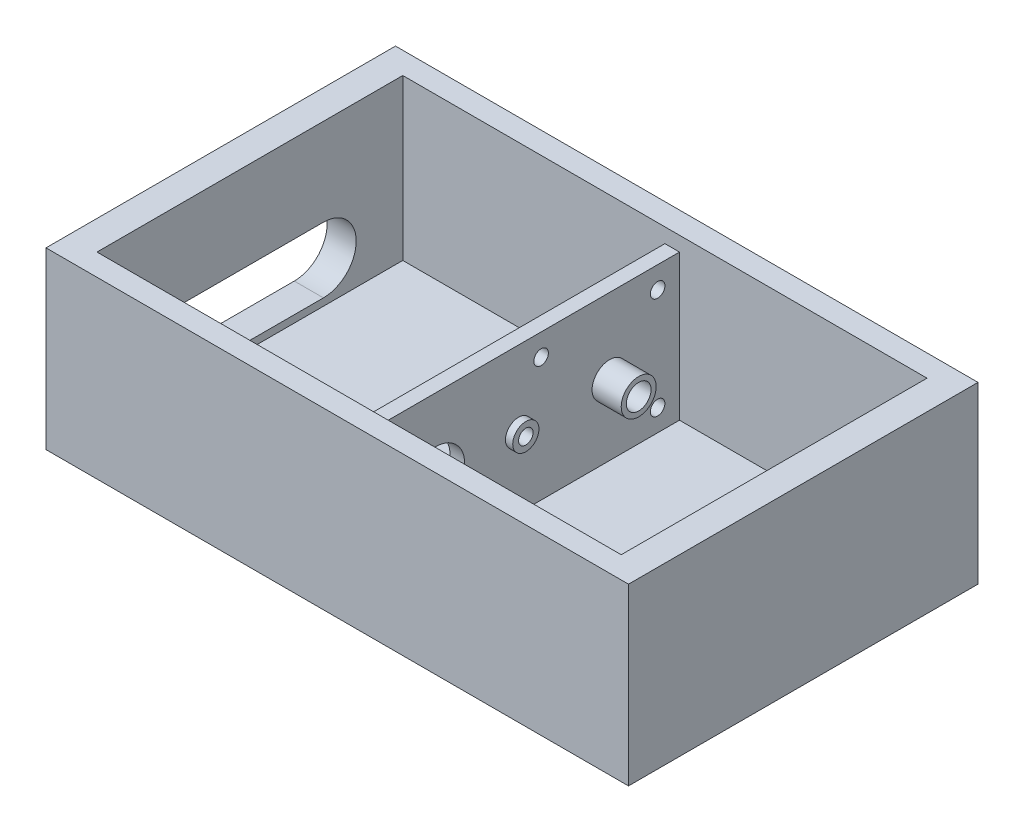
ISO-10303-21;
HEADER;
FILE_DESCRIPTION(('STEP AP214'),'2;1');
FILE_NAME('part.step','',(''),(''),'','','');
FILE_SCHEMA(('AUTOMOTIVE_DESIGN { 1 0 10303 214 1 1 1 1 }'));
ENDSEC;
DATA;
#1=APPLICATION_CONTEXT('core data for automotive mechanical design processes');
#2=APPLICATION_PROTOCOL_DEFINITION('international standard','automotive_design',2000,#1);
#3=PRODUCT_CONTEXT('',#1,'mechanical');
#4=PRODUCT('Part','Part','',(#3));
#5=PRODUCT_RELATED_PRODUCT_CATEGORY('part','',(#4));
#6=PRODUCT_DEFINITION_FORMATION('','',#4);
#7=PRODUCT_DEFINITION_CONTEXT('part definition',#1,'design');
#8=PRODUCT_DEFINITION('design','',#6,#7);
#9=PRODUCT_DEFINITION_SHAPE('','',#8);
#10=(LENGTH_UNIT() NAMED_UNIT(*) SI_UNIT(.MILLI.,.METRE.));
#11=(NAMED_UNIT(*) PLANE_ANGLE_UNIT() SI_UNIT($,.RADIAN.));
#12=(NAMED_UNIT(*) SI_UNIT($,.STERADIAN.) SOLID_ANGLE_UNIT());
#13=UNCERTAINTY_MEASURE_WITH_UNIT(LENGTH_MEASURE(1.E-05),#10,'distance_accuracy_value','');
#14=(GEOMETRIC_REPRESENTATION_CONTEXT(3) GLOBAL_UNCERTAINTY_ASSIGNED_CONTEXT((#13)) GLOBAL_UNIT_ASSIGNED_CONTEXT((#10,
#11,#12)) REPRESENTATION_CONTEXT('',''));
#15=CARTESIAN_POINT('',(0.,0.,0.));
#16=DIRECTION('',(0.,0.,1.));
#17=DIRECTION('',(1.,0.,0.));
#18=AXIS2_PLACEMENT_3D('',#15,#16,#17);
#19=CARTESIAN_POINT('',(2.,-5.,-10.5));
#20=DIRECTION('',(0.,0.,-1.));
#21=DIRECTION('',(-1.,0.,0.));
#22=AXIS2_PLACEMENT_3D('',#19,#20,#21);
#23=PLANE('',#22);
#24=DIRECTION('',(0.,-1.,0.));
#25=VECTOR('',#24,1.);
#26=CARTESIAN_POINT('',(20.,5.,-10.5));
#27=LINE('',#26,#25);
#28=CARTESIAN_POINT('',(20.,5.,-10.5));
#29=VERTEX_POINT('',#28);
#30=CARTESIAN_POINT('',(20.,-5.,-10.5));
#31=VERTEX_POINT('',#30);
#32=EDGE_CURVE('E187',#29,#31,#27,.T.);
#33=ORIENTED_EDGE('',*,*,#32,.F.);
#34=DIRECTION('',(-1.,0.,0.));
#35=VECTOR('',#34,1.);
#36=CARTESIAN_POINT('',(20.,5.,-10.5));
#37=LINE('',#36,#35);
#38=CARTESIAN_POINT('',(21.,5.,-10.5));
#39=VERTEX_POINT('',#38);
#40=EDGE_CURVE('E160',#39,#29,#37,.T.);
#41=ORIENTED_EDGE('',*,*,#40,.F.);
#42=DIRECTION('',(0.,-1.,0.));
#43=VECTOR('',#42,1.);
#44=CARTESIAN_POINT('',(21.,5.,-10.5));
#45=LINE('',#44,#43);
#46=CARTESIAN_POINT('',(21.,-5.,-10.5));
#47=VERTEX_POINT('',#46);
#48=EDGE_CURVE('E195',#39,#47,#45,.T.);
#49=ORIENTED_EDGE('',*,*,#48,.T.);
#50=DIRECTION('',(-1.,0.,0.));
#51=VECTOR('',#50,1.);
#52=CARTESIAN_POINT('',(2.,-5.,-10.5));
#53=LINE('',#52,#51);
#54=CARTESIAN_POINT('',(38.,-5.,-10.5));
#55=VERTEX_POINT('',#54);
#56=EDGE_CURVE('E258',#55,#47,#53,.T.);
#57=ORIENTED_EDGE('',*,*,#56,.F.);
#58=DIRECTION('',(0.,1.,0.));
#59=VECTOR('',#58,1.);
#60=CARTESIAN_POINT('',(38.,-5.,-10.5));
#61=LINE('',#60,#59);
#62=CARTESIAN_POINT('',(38.,6.,-10.5));
#63=VERTEX_POINT('',#62);
#64=EDGE_CURVE('E280',#55,#63,#61,.T.);
#65=ORIENTED_EDGE('',*,*,#64,.T.);
#66=DIRECTION('',(-1.,0.,0.));
#67=VECTOR('',#66,1.);
#68=CARTESIAN_POINT('',(2.,6.,-10.5));
#69=LINE('',#68,#67);
#70=CARTESIAN_POINT('',(2.,6.,-10.5));
#71=VERTEX_POINT('',#70);
#72=EDGE_CURVE('E249',#63,#71,#69,.T.);
#73=ORIENTED_EDGE('',*,*,#72,.T.);
#74=DIRECTION('',(0.,1.,0.));
#75=VECTOR('',#74,1.);
#76=CARTESIAN_POINT('',(2.,-5.,-10.5));
#77=LINE('',#76,#75);
#78=CARTESIAN_POINT('',(2.,-5.,-10.5));
#79=VERTEX_POINT('',#78);
#80=EDGE_CURVE('E276',#79,#71,#77,.T.);
#81=ORIENTED_EDGE('',*,*,#80,.F.);
#82=EDGE_CURVE('E257',#31,#79,#53,.T.);
#83=ORIENTED_EDGE('',*,*,#82,.F.);
#84=EDGE_LOOP('',(#33,#41,#49,#57,#65,#73,#81,#83));
#85=FACE_BOUND('',#84,.T.);
#86=ADVANCED_FACE('F39',(#85),#23,.F.);
#87=CARTESIAN_POINT('',(2.,-5.,10.5));
#88=DIRECTION('',(0.,0.,1.));
#89=DIRECTION('',(1.,0.,0.));
#90=AXIS2_PLACEMENT_3D('',#87,#88,#89);
#91=PLANE('',#90);
#92=DIRECTION('',(0.,-1.,0.));
#93=VECTOR('',#92,1.);
#94=CARTESIAN_POINT('',(20.,5.,10.5));
#95=LINE('',#94,#93);
#96=CARTESIAN_POINT('',(20.,5.,10.5));
#97=VERTEX_POINT('',#96);
#98=CARTESIAN_POINT('',(20.,-5.,10.5));
#99=VERTEX_POINT('',#98);
#100=EDGE_CURVE('E167',#97,#99,#95,.T.);
#101=ORIENTED_EDGE('',*,*,#100,.T.);
#102=DIRECTION('',(1.,0.,0.));
#103=VECTOR('',#102,1.);
#104=CARTESIAN_POINT('',(2.,-5.,10.5));
#105=LINE('',#104,#103);
#106=CARTESIAN_POINT('',(2.,-5.,10.5));
#107=VERTEX_POINT('',#106);
#108=EDGE_CURVE('E250',#107,#99,#105,.T.);
#109=ORIENTED_EDGE('',*,*,#108,.F.);
#110=DIRECTION('',(0.,1.,0.));
#111=VECTOR('',#110,1.);
#112=CARTESIAN_POINT('',(2.,-5.,10.5));
#113=LINE('',#112,#111);
#114=CARTESIAN_POINT('',(2.,6.,10.5));
#115=VERTEX_POINT('',#114);
#116=EDGE_CURVE('E262',#107,#115,#113,.T.);
#117=ORIENTED_EDGE('',*,*,#116,.T.);
#118=DIRECTION('',(1.,0.,0.));
#119=VECTOR('',#118,1.);
#120=CARTESIAN_POINT('',(2.,6.,10.5));
#121=LINE('',#120,#119);
#122=CARTESIAN_POINT('',(38.,6.,10.5));
#123=VERTEX_POINT('',#122);
#124=EDGE_CURVE('E265',#115,#123,#121,.T.);
#125=ORIENTED_EDGE('',*,*,#124,.T.);
#126=DIRECTION('',(0.,1.,0.));
#127=VECTOR('',#126,1.);
#128=CARTESIAN_POINT('',(38.,-5.,10.5));
#129=LINE('',#128,#127);
#130=CARTESIAN_POINT('',(38.,-5.,10.5));
#131=VERTEX_POINT('',#130);
#132=EDGE_CURVE('E283',#131,#123,#129,.T.);
#133=ORIENTED_EDGE('',*,*,#132,.F.);
#134=CARTESIAN_POINT('',(21.,-5.,10.5));
#135=VERTEX_POINT('',#134);
#136=EDGE_CURVE('E248',#135,#131,#105,.T.);
#137=ORIENTED_EDGE('',*,*,#136,.F.);
#138=DIRECTION('',(0.,-1.,0.));
#139=VECTOR('',#138,1.);
#140=CARTESIAN_POINT('',(21.,5.,10.5));
#141=LINE('',#140,#139);
#142=CARTESIAN_POINT('',(21.,5.,10.5));
#143=VERTEX_POINT('',#142);
#144=EDGE_CURVE('E56',#143,#135,#141,.T.);
#145=ORIENTED_EDGE('',*,*,#144,.F.);
#146=DIRECTION('',(1.,0.,0.));
#147=VECTOR('',#146,1.);
#148=CARTESIAN_POINT('',(20.,5.,10.5));
#149=LINE('',#148,#147);
#150=EDGE_CURVE('E158',#97,#143,#149,.T.);
#151=ORIENTED_EDGE('',*,*,#150,.F.);
#152=EDGE_LOOP('',(#101,#109,#117,#125,#133,#137,#145,#151));
#153=FACE_BOUND('',#152,.T.);
#154=ADVANCED_FACE('F176',(#153),#91,.F.);
#155=CARTESIAN_POINT('',(0.,-5.,0.));
#156=DIRECTION('',(0.,1.,0.));
#157=DIRECTION('',(0.,0.,1.));
#158=AXIS2_PLACEMENT_3D('',#155,#156,#157);
#159=PLANE('',#158);
#160=ORIENTED_EDGE('',*,*,#108,.T.);
#161=DIRECTION('',(0.,0.,1.));
#162=VECTOR('',#161,1.);
#163=CARTESIAN_POINT('',(20.,-5.,-10.5));
#164=LINE('',#163,#162);
#165=EDGE_CURVE('E170',#31,#99,#164,.T.);
#166=ORIENTED_EDGE('',*,*,#165,.F.);
#167=ORIENTED_EDGE('',*,*,#82,.T.);
#168=DIRECTION('',(0.,0.,1.));
#169=VECTOR('',#168,1.);
#170=CARTESIAN_POINT('',(2.,-5.,-10.5));
#171=LINE('',#170,#169);
#172=EDGE_CURVE('E244',#79,#107,#171,.T.);
#173=ORIENTED_EDGE('',*,*,#172,.T.);
#174=EDGE_LOOP('',(#160,#166,#167,#173));
#175=FACE_BOUND('',#174,.T.);
#176=ADVANCED_FACE('F362',(#175),#159,.T.);
#177=ORIENTED_EDGE('',*,*,#56,.T.);
#178=DIRECTION('',(0.,0.,-1.));
#179=VECTOR('',#178,1.);
#180=CARTESIAN_POINT('',(21.,-5.,-10.5));
#181=LINE('',#180,#179);
#182=EDGE_CURVE('E164',#135,#47,#181,.T.);
#183=ORIENTED_EDGE('',*,*,#182,.F.);
#184=ORIENTED_EDGE('',*,*,#136,.T.);
#185=DIRECTION('',(0.,0.,-1.));
#186=VECTOR('',#185,1.);
#187=CARTESIAN_POINT('',(38.,-5.,-10.5));
#188=LINE('',#187,#186);
#189=EDGE_CURVE('E253',#131,#55,#188,.T.);
#190=ORIENTED_EDGE('',*,*,#189,.T.);
#191=EDGE_LOOP('',(#177,#183,#184,#190));
#192=FACE_BOUND('',#191,.T.);
#193=ADVANCED_FACE('F344',(#192),#159,.T.);
#194=CARTESIAN_POINT('',(40.,6.,-12.));
#195=DIRECTION('',(0.,0.,1.));
#196=DIRECTION('',(0.,-1.,0.));
#197=AXIS2_PLACEMENT_3D('',#194,#195,#196);
#198=PLANE('',#197);
#199=DIRECTION('',(0.,1.,0.));
#200=VECTOR('',#199,1.);
#201=CARTESIAN_POINT('',(0.,6.,-12.));
#202=LINE('',#201,#200);
#203=CARTESIAN_POINT('',(0.,-6.,-12.));
#204=VERTEX_POINT('',#203);
#205=CARTESIAN_POINT('',(0.,6.,-12.));
#206=VERTEX_POINT('',#205);
#207=EDGE_CURVE('E279',#204,#206,#202,.T.);
#208=ORIENTED_EDGE('',*,*,#207,.T.);
#209=DIRECTION('',(-1.,0.,0.));
#210=VECTOR('',#209,1.);
#211=CARTESIAN_POINT('',(40.,6.,-12.));
#212=LINE('',#211,#210);
#213=CARTESIAN_POINT('',(40.,6.,-12.));
#214=VERTEX_POINT('',#213);
#215=EDGE_CURVE('E326',#214,#206,#212,.T.);
#216=ORIENTED_EDGE('',*,*,#215,.F.);
#217=DIRECTION('',(0.,1.,0.));
#218=VECTOR('',#217,1.);
#219=CARTESIAN_POINT('',(40.,6.,-12.));
#220=LINE('',#219,#218);
#221=CARTESIAN_POINT('',(40.,-6.,-12.));
#222=VERTEX_POINT('',#221);
#223=EDGE_CURVE('E289',#222,#214,#220,.T.);
#224=ORIENTED_EDGE('',*,*,#223,.F.);
#225=DIRECTION('',(-1.,0.,0.));
#226=VECTOR('',#225,1.);
#227=CARTESIAN_POINT('',(40.,-6.,-12.));
#228=LINE('',#227,#226);
#229=EDGE_CURVE('E303',#222,#204,#228,.T.);
#230=ORIENTED_EDGE('',*,*,#229,.T.);
#231=EDGE_LOOP('',(#208,#216,#224,#230));
#232=FACE_BOUND('',#231,.T.);
#233=ADVANCED_FACE('F41',(#232),#198,.F.);
#234=CARTESIAN_POINT('',(40.,6.,12.));
#235=DIRECTION('',(0.,-1.,0.));
#236=DIRECTION('',(0.,0.,-1.));
#237=AXIS2_PLACEMENT_3D('',#234,#235,#236);
#238=PLANE('',#237);
#239=ORIENTED_EDGE('',*,*,#124,.F.);
#240=DIRECTION('',(0.,0.,1.));
#241=VECTOR('',#240,1.);
#242=CARTESIAN_POINT('',(2.,6.,-10.5));
#243=LINE('',#242,#241);
#244=EDGE_CURVE('E235',#71,#115,#243,.T.);
#245=ORIENTED_EDGE('',*,*,#244,.F.);
#246=ORIENTED_EDGE('',*,*,#72,.F.);
#247=DIRECTION('',(0.,0.,-1.));
#248=VECTOR('',#247,1.);
#249=CARTESIAN_POINT('',(38.,6.,-10.5));
#250=LINE('',#249,#248);
#251=EDGE_CURVE('E269',#123,#63,#250,.T.);
#252=ORIENTED_EDGE('',*,*,#251,.F.);
#253=EDGE_LOOP('',(#239,#245,#246,#252));
#254=FACE_BOUND('',#253,.T.);
#255=DIRECTION('',(0.,0.,1.));
#256=VECTOR('',#255,1.);
#257=CARTESIAN_POINT('',(0.,6.,12.));
#258=LINE('',#257,#256);
#259=CARTESIAN_POINT('',(0.,6.,12.));
#260=VERTEX_POINT('',#259);
#261=EDGE_CURVE('E307',#206,#260,#258,.T.);
#262=ORIENTED_EDGE('',*,*,#261,.T.);
#263=DIRECTION('',(-1.,0.,0.));
#264=VECTOR('',#263,1.);
#265=CARTESIAN_POINT('',(40.,6.,12.));
#266=LINE('',#265,#264);
#267=CARTESIAN_POINT('',(40.,6.,12.));
#268=VERTEX_POINT('',#267);
#269=EDGE_CURVE('E322',#268,#260,#266,.T.);
#270=ORIENTED_EDGE('',*,*,#269,.F.);
#271=DIRECTION('',(0.,0.,1.));
#272=VECTOR('',#271,1.);
#273=CARTESIAN_POINT('',(40.,6.,12.));
#274=LINE('',#273,#272);
#275=EDGE_CURVE('E293',#214,#268,#274,.T.);
#276=ORIENTED_EDGE('',*,*,#275,.F.);
#277=ORIENTED_EDGE('',*,*,#215,.T.);
#278=EDGE_LOOP('',(#262,#270,#276,#277));
#279=FACE_BOUND('',#278,.T.);
#280=ADVANCED_FACE('F357',(#254,#279),#238,.F.);
#281=CARTESIAN_POINT('',(40.,6.,12.));
#282=DIRECTION('',(0.,0.,-1.));
#283=DIRECTION('',(0.,1.,0.));
#284=AXIS2_PLACEMENT_3D('',#281,#282,#283);
#285=PLANE('',#284);
#286=DIRECTION('',(0.,-1.,0.));
#287=VECTOR('',#286,1.);
#288=CARTESIAN_POINT('',(0.,6.,12.));
#289=LINE('',#288,#287);
#290=CARTESIAN_POINT('',(0.,-6.,12.));
#291=VERTEX_POINT('',#290);
#292=EDGE_CURVE('E310',#260,#291,#289,.T.);
#293=ORIENTED_EDGE('',*,*,#292,.T.);
#294=DIRECTION('',(-1.,0.,0.));
#295=VECTOR('',#294,1.);
#296=CARTESIAN_POINT('',(40.,-6.,12.));
#297=LINE('',#296,#295);
#298=CARTESIAN_POINT('',(40.,-6.,12.));
#299=VERTEX_POINT('',#298);
#300=EDGE_CURVE('E318',#299,#291,#297,.T.);
#301=ORIENTED_EDGE('',*,*,#300,.F.);
#302=DIRECTION('',(0.,-1.,0.));
#303=VECTOR('',#302,1.);
#304=CARTESIAN_POINT('',(40.,6.,12.));
#305=LINE('',#304,#303);
#306=EDGE_CURVE('E297',#268,#299,#305,.T.);
#307=ORIENTED_EDGE('',*,*,#306,.F.);
#308=ORIENTED_EDGE('',*,*,#269,.T.);
#309=EDGE_LOOP('',(#293,#301,#307,#308));
#310=FACE_BOUND('',#309,.T.);
#311=ADVANCED_FACE('F396',(#310),#285,.F.);
#312=CARTESIAN_POINT('',(40.,-6.,12.));
#313=DIRECTION('',(0.,1.,0.));
#314=DIRECTION('',(0.,0.,1.));
#315=AXIS2_PLACEMENT_3D('',#312,#313,#314);
#316=PLANE('',#315);
#317=DIRECTION('',(0.,0.,-1.));
#318=VECTOR('',#317,1.);
#319=CARTESIAN_POINT('',(0.,-6.,12.));
#320=LINE('',#319,#318);
#321=EDGE_CURVE('E294',#291,#204,#320,.T.);
#322=ORIENTED_EDGE('',*,*,#321,.T.);
#323=ORIENTED_EDGE('',*,*,#229,.F.);
#324=DIRECTION('',(0.,0.,-1.));
#325=VECTOR('',#324,1.);
#326=CARTESIAN_POINT('',(40.,-6.,12.));
#327=LINE('',#326,#325);
#328=EDGE_CURVE('E300',#299,#222,#327,.T.);
#329=ORIENTED_EDGE('',*,*,#328,.F.);
#330=ORIENTED_EDGE('',*,*,#300,.T.);
#331=EDGE_LOOP('',(#322,#323,#329,#330));
#332=FACE_BOUND('',#331,.T.);
#333=ADVANCED_FACE('F389',(#332),#316,.F.);
#334=CARTESIAN_POINT('',(40.,0.,0.));
#335=DIRECTION('',(1.,0.,0.));
#336=DIRECTION('',(0.,0.,-1.));
#337=AXIS2_PLACEMENT_3D('',#334,#335,#336);
#338=PLANE('',#337);
#339=ORIENTED_EDGE('',*,*,#223,.T.);
#340=ORIENTED_EDGE('',*,*,#275,.T.);
#341=ORIENTED_EDGE('',*,*,#306,.T.);
#342=ORIENTED_EDGE('',*,*,#328,.T.);
#343=EDGE_LOOP('',(#339,#340,#341,#342));
#344=FACE_BOUND('',#343,.T.);
#345=ADVANCED_FACE('F386',(#344),#338,.T.);
#346=CARTESIAN_POINT('',(0.,0.,0.));
#347=DIRECTION('',(1.,0.,0.));
#348=DIRECTION('',(0.,0.,-1.));
#349=AXIS2_PLACEMENT_3D('',#346,#347,#348);
#350=PLANE('',#349);
#351=DIRECTION('',(0.,0.,1.));
#352=VECTOR('',#351,1.);
#353=CARTESIAN_POINT('',(0.,-4.5,-5.05));
#354=LINE('',#353,#352);
#355=CARTESIAN_POINT('',(0.,-4.5,-5.05));
#356=VERTEX_POINT('',#355);
#357=CARTESIAN_POINT('',(0.,-4.5,6.45));
#358=VERTEX_POINT('',#357);
#359=EDGE_CURVE('E221',#356,#358,#354,.T.);
#360=ORIENTED_EDGE('',*,*,#359,.F.);
#361=CARTESIAN_POINT('',(0.,-2.25,-5.05));
#362=DIRECTION('',(-1.,0.,0.));
#363=DIRECTION('',(0.,0.,1.));
#364=AXIS2_PLACEMENT_3D('',#361,#362,#363);
#365=CIRCLE('',#364,2.25);
#366=CARTESIAN_POINT('',(0.,0.,-5.05));
#367=VERTEX_POINT('',#366);
#368=EDGE_CURVE('E64',#367,#356,#365,.T.);
#369=ORIENTED_EDGE('',*,*,#368,.F.);
#370=DIRECTION('',(0.,0.,-1.));
#371=VECTOR('',#370,1.);
#372=CARTESIAN_POINT('',(0.,0.,-5.05));
#373=LINE('',#372,#371);
#374=CARTESIAN_POINT('',(0.,0.,6.45));
#375=VERTEX_POINT('',#374);
#376=EDGE_CURVE('E206',#375,#367,#373,.T.);
#377=ORIENTED_EDGE('',*,*,#376,.F.);
#378=CARTESIAN_POINT('',(0.,-2.25,6.45));
#379=DIRECTION('',(-1.,0.,0.));
#380=DIRECTION('',(0.,0.,1.));
#381=AXIS2_PLACEMENT_3D('',#378,#379,#380);
#382=CIRCLE('',#381,2.25);
#383=EDGE_CURVE('E225',#358,#375,#382,.T.);
#384=ORIENTED_EDGE('',*,*,#383,.F.);
#385=EDGE_LOOP('',(#360,#369,#377,#384));
#386=FACE_BOUND('',#385,.T.);
#387=ORIENTED_EDGE('',*,*,#207,.F.);
#388=ORIENTED_EDGE('',*,*,#321,.F.);
#389=ORIENTED_EDGE('',*,*,#292,.F.);
#390=ORIENTED_EDGE('',*,*,#261,.F.);
#391=EDGE_LOOP('',(#387,#388,#389,#390));
#392=FACE_BOUND('',#391,.T.);
#393=ADVANCED_FACE('F384',(#386,#392),#350,.F.);
#394=CARTESIAN_POINT('',(2.,-5.,-10.5));
#395=DIRECTION('',(-1.,0.,0.));
#396=DIRECTION('',(0.,0.,1.));
#397=AXIS2_PLACEMENT_3D('',#394,#395,#396);
#398=PLANE('',#397);
#399=DIRECTION('',(0.,0.,-1.));
#400=VECTOR('',#399,1.);
#401=CARTESIAN_POINT('',(2.,0.,-5.05));
#402=LINE('',#401,#400);
#403=CARTESIAN_POINT('',(2.,0.,6.45));
#404=VERTEX_POINT('',#403);
#405=CARTESIAN_POINT('',(2.,0.,-5.05));
#406=VERTEX_POINT('',#405);
#407=EDGE_CURVE('E214',#404,#406,#402,.T.);
#408=ORIENTED_EDGE('',*,*,#407,.T.);
#409=CARTESIAN_POINT('',(2.,-2.25,-5.05));
#410=DIRECTION('',(-1.,0.,0.));
#411=DIRECTION('',(0.,0.,1.));
#412=AXIS2_PLACEMENT_3D('',#409,#410,#411);
#413=CIRCLE('',#412,2.25);
#414=CARTESIAN_POINT('',(2.,-4.5,-5.05));
#415=VERTEX_POINT('',#414);
#416=EDGE_CURVE('E201',#406,#415,#413,.T.);
#417=ORIENTED_EDGE('',*,*,#416,.T.);
#418=DIRECTION('',(0.,0.,1.));
#419=VECTOR('',#418,1.);
#420=CARTESIAN_POINT('',(2.,-4.5,-5.05));
#421=LINE('',#420,#419);
#422=CARTESIAN_POINT('',(2.,-4.5,6.44999999999999));
#423=VERTEX_POINT('',#422);
#424=EDGE_CURVE('E205',#415,#423,#421,.T.);
#425=ORIENTED_EDGE('',*,*,#424,.T.);
#426=CARTESIAN_POINT('',(2.,-2.25,6.45));
#427=DIRECTION('',(-1.,0.,0.));
#428=DIRECTION('',(0.,0.,1.));
#429=AXIS2_PLACEMENT_3D('',#426,#427,#428);
#430=CIRCLE('',#429,2.25);
#431=EDGE_CURVE('E210',#423,#404,#430,.T.);
#432=ORIENTED_EDGE('',*,*,#431,.T.);
#433=EDGE_LOOP('',(#408,#417,#425,#432));
#434=FACE_BOUND('',#433,.T.);
#435=ORIENTED_EDGE('',*,*,#244,.T.);
#436=ORIENTED_EDGE('',*,*,#116,.F.);
#437=ORIENTED_EDGE('',*,*,#172,.F.);
#438=ORIENTED_EDGE('',*,*,#80,.T.);
#439=EDGE_LOOP('',(#435,#436,#437,#438));
#440=FACE_BOUND('',#439,.T.);
#441=ADVANCED_FACE('F360',(#434,#440),#398,.F.);
#442=CARTESIAN_POINT('',(38.,-5.,-10.5));
#443=DIRECTION('',(1.,0.,0.));
#444=DIRECTION('',(0.,0.,-1.));
#445=AXIS2_PLACEMENT_3D('',#442,#443,#444);
#446=PLANE('',#445);
#447=CARTESIAN_POINT('',(38.,-0.200000000000001,0.549999999999999));
#448=DIRECTION('',(1.,0.,0.));
#449=DIRECTION('',(0.,0.,-1.));
#450=AXIS2_PLACEMENT_3D('',#447,#448,#449);
#451=CIRCLE('',#450,0.5);
#452=CARTESIAN_POINT('',(38.,-0.200000000000001,0.049999999999999));
#453=VERTEX_POINT('',#452);
#454=EDGE_CURVE('E700',#453,#453,#451,.F.);
#455=ORIENTED_EDGE('',*,*,#454,.F.);
#456=EDGE_LOOP('',(#455));
#457=FACE_BOUND('',#456,.T.);
#458=ORIENTED_EDGE('',*,*,#251,.T.);
#459=ORIENTED_EDGE('',*,*,#64,.F.);
#460=ORIENTED_EDGE('',*,*,#189,.F.);
#461=ORIENTED_EDGE('',*,*,#132,.T.);
#462=EDGE_LOOP('',(#458,#459,#460,#461));
#463=FACE_BOUND('',#462,.T.);
#464=ADVANCED_FACE('F348',(#457,#463),#446,.F.);
#465=CARTESIAN_POINT('',(2.,-2.25,-5.05));
#466=DIRECTION('',(-1.,0.,0.));
#467=DIRECTION('',(0.,0.,1.));
#468=AXIS2_PLACEMENT_3D('',#465,#466,#467);
#469=CYLINDRICAL_SURFACE('',#468,2.25);
#470=ORIENTED_EDGE('',*,*,#368,.T.);
#471=DIRECTION('',(-1.,0.,0.));
#472=VECTOR('',#471,1.);
#473=CARTESIAN_POINT('',(2.,-4.5,-5.05));
#474=LINE('',#473,#472);
#475=EDGE_CURVE('E218',#415,#356,#474,.T.);
#476=ORIENTED_EDGE('',*,*,#475,.F.);
#477=ORIENTED_EDGE('',*,*,#416,.F.);
#478=DIRECTION('',(-1.,0.,0.));
#479=VECTOR('',#478,1.);
#480=CARTESIAN_POINT('',(2.,0.,-5.05));
#481=LINE('',#480,#479);
#482=EDGE_CURVE('E232',#406,#367,#481,.T.);
#483=ORIENTED_EDGE('',*,*,#482,.T.);
#484=EDGE_LOOP('',(#470,#476,#477,#483));
#485=FACE_BOUND('',#484,.T.);
#486=ADVANCED_FACE('F379',(#485),#469,.F.);
#487=CARTESIAN_POINT('',(2.,0.,-5.05));
#488=DIRECTION('',(0.,1.,0.));
#489=DIRECTION('',(0.,0.,1.));
#490=AXIS2_PLACEMENT_3D('',#487,#488,#489);
#491=PLANE('',#490);
#492=ORIENTED_EDGE('',*,*,#376,.T.);
#493=ORIENTED_EDGE('',*,*,#482,.F.);
#494=ORIENTED_EDGE('',*,*,#407,.F.);
#495=DIRECTION('',(-1.,0.,0.));
#496=VECTOR('',#495,1.);
#497=CARTESIAN_POINT('',(2.,0.,6.45));
#498=LINE('',#497,#496);
#499=EDGE_CURVE('E236',#404,#375,#498,.T.);
#500=ORIENTED_EDGE('',*,*,#499,.T.);
#501=EDGE_LOOP('',(#492,#493,#494,#500));
#502=FACE_BOUND('',#501,.T.);
#503=ADVANCED_FACE('F588',(#502),#491,.F.);
#504=CARTESIAN_POINT('',(2.,-2.25,6.45));
#505=DIRECTION('',(-1.,0.,0.));
#506=DIRECTION('',(0.,0.,1.));
#507=AXIS2_PLACEMENT_3D('',#504,#505,#506);
#508=CYLINDRICAL_SURFACE('',#507,2.25);
#509=ORIENTED_EDGE('',*,*,#383,.T.);
#510=ORIENTED_EDGE('',*,*,#499,.F.);
#511=ORIENTED_EDGE('',*,*,#431,.F.);
#512=DIRECTION('',(-1.,0.,0.));
#513=VECTOR('',#512,1.);
#514=CARTESIAN_POINT('',(2.,-4.5,6.45));
#515=LINE('',#514,#513);
#516=EDGE_CURVE('E239',#423,#358,#515,.T.);
#517=ORIENTED_EDGE('',*,*,#516,.T.);
#518=EDGE_LOOP('',(#509,#510,#511,#517));
#519=FACE_BOUND('',#518,.T.);
#520=ADVANCED_FACE('F591',(#519),#508,.F.);
#521=CARTESIAN_POINT('',(2.,-4.5,-5.05));
#522=DIRECTION('',(0.,-1.,0.));
#523=DIRECTION('',(0.,0.,-1.));
#524=AXIS2_PLACEMENT_3D('',#521,#522,#523);
#525=PLANE('',#524);
#526=ORIENTED_EDGE('',*,*,#359,.T.);
#527=ORIENTED_EDGE('',*,*,#516,.F.);
#528=ORIENTED_EDGE('',*,*,#424,.F.);
#529=ORIENTED_EDGE('',*,*,#475,.T.);
#530=EDGE_LOOP('',(#526,#527,#528,#529));
#531=FACE_BOUND('',#530,.T.);
#532=ADVANCED_FACE('F546',(#531),#525,.F.);
#533=CARTESIAN_POINT('',(20.,5.,-10.5));
#534=DIRECTION('',(1.,0.,0.));
#535=DIRECTION('',(0.,0.,-1.));
#536=AXIS2_PLACEMENT_3D('',#533,#534,#535);
#537=PLANE('',#536);
#538=CARTESIAN_POINT('',(20.,-3.5,-9.));
#539=DIRECTION('',(1.,0.,0.));
#540=DIRECTION('',(0.,0.,-1.));
#541=AXIS2_PLACEMENT_3D('',#538,#539,#540);
#542=CIRCLE('',#541,0.500000000000001);
#543=CARTESIAN_POINT('',(20.,-3.5,-9.5));
#544=VERTEX_POINT('',#543);
#545=EDGE_CURVE('E674',#544,#544,#542,.T.);
#546=ORIENTED_EDGE('',*,*,#545,.T.);
#547=EDGE_LOOP('',(#546));
#548=FACE_BOUND('',#547,.T.);
#549=CARTESIAN_POINT('',(20.,3.5,-9.));
#550=DIRECTION('',(1.,0.,0.));
#551=DIRECTION('',(0.,0.,-1.));
#552=AXIS2_PLACEMENT_3D('',#549,#550,#551);
#553=CIRCLE('',#552,0.500000000000001);
#554=CARTESIAN_POINT('',(20.,3.5,-9.5));
#555=VERTEX_POINT('',#554);
#556=EDGE_CURVE('E677',#555,#555,#553,.T.);
#557=ORIENTED_EDGE('',*,*,#556,.T.);
#558=EDGE_LOOP('',(#557));
#559=FACE_BOUND('',#558,.T.);
#560=CARTESIAN_POINT('',(20.,3.5,-0.999999999999999));
#561=DIRECTION('',(1.,0.,0.));
#562=DIRECTION('',(0.,0.,-1.));
#563=AXIS2_PLACEMENT_3D('',#560,#561,#562);
#564=CIRCLE('',#563,0.5);
#565=CARTESIAN_POINT('',(20.,3.5,-1.5));
#566=VERTEX_POINT('',#565);
#567=EDGE_CURVE('E685',#566,#566,#564,.T.);
#568=ORIENTED_EDGE('',*,*,#567,.T.);
#569=EDGE_LOOP('',(#568));
#570=FACE_BOUND('',#569,.T.);
#571=CARTESIAN_POINT('',(20.,-0.200000000000001,6.25));
#572=DIRECTION('',(1.,0.,0.));
#573=DIRECTION('',(0.,0.,-1.));
#574=AXIS2_PLACEMENT_3D('',#571,#572,#573);
#575=CIRCLE('',#574,2.);
#576=CARTESIAN_POINT('',(20.,-0.200000000000001,4.25));
#577=VERTEX_POINT('',#576);
#578=EDGE_CURVE('E682',#577,#577,#575,.T.);
#579=ORIENTED_EDGE('',*,*,#578,.T.);
#580=EDGE_LOOP('',(#579));
#581=FACE_BOUND('',#580,.T.);
#582=CARTESIAN_POINT('',(20.,-0.200000000000001,0.550000000000002));
#583=DIRECTION('',(1.,0.,0.));
#584=DIRECTION('',(0.,0.,-1.));
#585=AXIS2_PLACEMENT_3D('',#582,#583,#584);
#586=CIRCLE('',#585,0.5);
#587=CARTESIAN_POINT('',(20.,-0.200000000000001,0.050000000000002));
#588=VERTEX_POINT('',#587);
#589=EDGE_CURVE('E696',#588,#588,#586,.F.);
#590=ORIENTED_EDGE('',*,*,#589,.F.);
#591=EDGE_LOOP('',(#590));
#592=FACE_BOUND('',#591,.T.);
#593=CARTESIAN_POINT('',(20.,-0.200000000000001,-5.7));
#594=DIRECTION('',(-1.,0.,0.));
#595=DIRECTION('',(0.,0.,1.));
#596=AXIS2_PLACEMENT_3D('',#593,#594,#595);
#597=CIRCLE('',#596,0.85);
#598=CARTESIAN_POINT('',(20.,-0.200000000000001,-4.85));
#599=VERTEX_POINT('',#598);
#600=EDGE_CURVE('E190',#599,#599,#597,.T.);
#601=ORIENTED_EDGE('',*,*,#600,.F.);
#602=EDGE_LOOP('',(#601));
#603=FACE_BOUND('',#602,.T.);
#604=ORIENTED_EDGE('',*,*,#165,.T.);
#605=ORIENTED_EDGE('',*,*,#100,.F.);
#606=DIRECTION('',(0.,0.,1.));
#607=VECTOR('',#606,1.);
#608=CARTESIAN_POINT('',(20.,5.,-10.5));
#609=LINE('',#608,#607);
#610=EDGE_CURVE('E154',#29,#97,#609,.T.);
#611=ORIENTED_EDGE('',*,*,#610,.F.);
#612=ORIENTED_EDGE('',*,*,#32,.T.);
#613=EDGE_LOOP('',(#604,#605,#611,#612));
#614=FACE_BOUND('',#613,.T.);
#615=ADVANCED_FACE('F168',(#548,#559,#570,#581,#592,#603,#614),#537,.F.);
#616=CARTESIAN_POINT('',(21.,5.,-10.5));
#617=DIRECTION('',(-1.,0.,0.));
#618=DIRECTION('',(0.,0.,1.));
#619=AXIS2_PLACEMENT_3D('',#616,#617,#618);
#620=PLANE('',#619);
#621=CARTESIAN_POINT('',(21.,-3.5,-9.));
#622=DIRECTION('',(1.,0.,0.));
#623=DIRECTION('',(0.,0.,-1.));
#624=AXIS2_PLACEMENT_3D('',#621,#622,#623);
#625=CIRCLE('',#624,0.500000000000001);
#626=CARTESIAN_POINT('',(21.,-3.5,-9.5));
#627=VERTEX_POINT('',#626);
#628=EDGE_CURVE('E671',#627,#627,#625,.T.);
#629=ORIENTED_EDGE('',*,*,#628,.F.);
#630=EDGE_LOOP('',(#629));
#631=FACE_BOUND('',#630,.T.);
#632=CARTESIAN_POINT('',(21.,3.5,-9.));
#633=DIRECTION('',(1.,0.,0.));
#634=DIRECTION('',(0.,0.,-1.));
#635=AXIS2_PLACEMENT_3D('',#632,#633,#634);
#636=CIRCLE('',#635,0.500000000000001);
#637=CARTESIAN_POINT('',(21.,3.5,-9.5));
#638=VERTEX_POINT('',#637);
#639=EDGE_CURVE('E747',#638,#638,#636,.T.);
#640=ORIENTED_EDGE('',*,*,#639,.F.);
#641=EDGE_LOOP('',(#640));
#642=FACE_BOUND('',#641,.T.);
#643=CARTESIAN_POINT('',(21.,3.5,-0.999999999999999));
#644=DIRECTION('',(1.,0.,0.));
#645=DIRECTION('',(0.,0.,-1.));
#646=AXIS2_PLACEMENT_3D('',#643,#644,#645);
#647=CIRCLE('',#646,0.5);
#648=CARTESIAN_POINT('',(21.,3.5,-1.5));
#649=VERTEX_POINT('',#648);
#650=EDGE_CURVE('E743',#649,#649,#647,.T.);
#651=ORIENTED_EDGE('',*,*,#650,.F.);
#652=EDGE_LOOP('',(#651));
#653=FACE_BOUND('',#652,.T.);
#654=CARTESIAN_POINT('',(21.,-0.200000000000001,6.25));
#655=DIRECTION('',(1.,0.,0.));
#656=DIRECTION('',(0.,0.,-1.));
#657=AXIS2_PLACEMENT_3D('',#654,#655,#656);
#658=CIRCLE('',#657,2.);
#659=CARTESIAN_POINT('',(21.,-0.200000000000001,4.25));
#660=VERTEX_POINT('',#659);
#661=EDGE_CURVE('E676',#660,#660,#658,.T.);
#662=ORIENTED_EDGE('',*,*,#661,.F.);
#663=EDGE_LOOP('',(#662));
#664=FACE_BOUND('',#663,.T.);
#665=CARTESIAN_POINT('',(21.,-0.200000000000001,0.550000000000002));
#666=DIRECTION('',(-1.,0.,0.));
#667=DIRECTION('',(0.,0.,1.));
#668=AXIS2_PLACEMENT_3D('',#665,#666,#667);
#669=CIRCLE('',#668,0.9);
#670=CARTESIAN_POINT('',(21.,-0.200000000000001,1.45));
#671=VERTEX_POINT('',#670);
#672=EDGE_CURVE('E11',#671,#671,#669,.F.);
#673=ORIENTED_EDGE('',*,*,#672,.F.);
#674=EDGE_LOOP('',(#673));
#675=FACE_BOUND('',#674,.T.);
#676=CARTESIAN_POINT('',(21.,-0.200000000000001,-5.7));
#677=DIRECTION('',(-1.,0.,0.));
#678=DIRECTION('',(0.,0.,1.));
#679=AXIS2_PLACEMENT_3D('',#676,#677,#678);
#680=CIRCLE('',#679,1.2);
#681=CARTESIAN_POINT('',(21.,-0.200000000000001,-4.5));
#682=VERTEX_POINT('',#681);
#683=EDGE_CURVE('E49',#682,#682,#680,.F.);
#684=ORIENTED_EDGE('',*,*,#683,.F.);
#685=EDGE_LOOP('',(#684));
#686=FACE_BOUND('',#685,.T.);
#687=ORIENTED_EDGE('',*,*,#182,.T.);
#688=ORIENTED_EDGE('',*,*,#48,.F.);
#689=DIRECTION('',(0.,0.,-1.));
#690=VECTOR('',#689,1.);
#691=CARTESIAN_POINT('',(21.,5.,-10.5));
#692=LINE('',#691,#690);
#693=EDGE_CURVE('E179',#143,#39,#692,.T.);
#694=ORIENTED_EDGE('',*,*,#693,.F.);
#695=ORIENTED_EDGE('',*,*,#144,.T.);
#696=EDGE_LOOP('',(#687,#688,#694,#695));
#697=FACE_BOUND('',#696,.T.);
#698=ADVANCED_FACE('F336',(#631,#642,#653,#664,#675,#686,#697),#620,.F.);
#699=CARTESIAN_POINT('',(0.,5.,0.));
#700=DIRECTION('',(0.,1.,0.));
#701=DIRECTION('',(0.,0.,1.));
#702=AXIS2_PLACEMENT_3D('',#699,#700,#701);
#703=PLANE('',#702);
#704=ORIENTED_EDGE('',*,*,#610,.T.);
#705=ORIENTED_EDGE('',*,*,#150,.T.);
#706=ORIENTED_EDGE('',*,*,#693,.T.);
#707=ORIENTED_EDGE('',*,*,#40,.T.);
#708=EDGE_LOOP('',(#704,#705,#706,#707));
#709=FACE_BOUND('',#708,.T.);
#710=ADVANCED_FACE('F156',(#709),#703,.T.);
#711=CARTESIAN_POINT('',(23.,-0.200000000000001,-5.7));
#712=DIRECTION('',(-1.,0.,0.));
#713=DIRECTION('',(0.,0.,1.));
#714=AXIS2_PLACEMENT_3D('',#711,#712,#713);
#715=CYLINDRICAL_SURFACE('',#714,0.85);
#716=ORIENTED_EDGE('',*,*,#600,.T.);
#717=EDGE_LOOP('',(#716));
#718=FACE_BOUND('',#717,.T.);
#719=CARTESIAN_POINT('',(23.,-0.200000000000001,-5.7));
#720=DIRECTION('',(1.,0.,0.));
#721=DIRECTION('',(0.,0.,-1.));
#722=AXIS2_PLACEMENT_3D('',#719,#720,#721);
#723=CIRCLE('',#722,0.85);
#724=CARTESIAN_POINT('',(23.,-0.200000000000001,-6.55));
#725=VERTEX_POINT('',#724);
#726=EDGE_CURVE('E708',#725,#725,#723,.T.);
#727=ORIENTED_EDGE('',*,*,#726,.T.);
#728=EDGE_LOOP('',(#727));
#729=FACE_BOUND('',#728,.T.);
#730=ADVANCED_FACE('F436',(#718,#729),#715,.F.);
#731=CARTESIAN_POINT('',(23.,-0.200000000000001,-5.7));
#732=DIRECTION('',(-1.,0.,0.));
#733=DIRECTION('',(0.,0.,1.));
#734=AXIS2_PLACEMENT_3D('',#731,#732,#733);
#735=CYLINDRICAL_SURFACE('',#734,1.2);
#736=CARTESIAN_POINT('',(23.,-0.200000000000001,-5.7));
#737=DIRECTION('',(1.,0.,0.));
#738=DIRECTION('',(0.,0.,-1.));
#739=AXIS2_PLACEMENT_3D('',#736,#737,#738);
#740=CIRCLE('',#739,1.2);
#741=CARTESIAN_POINT('',(23.,-0.200000000000001,-6.9));
#742=VERTEX_POINT('',#741);
#743=EDGE_CURVE('E712',#742,#742,#740,.T.);
#744=ORIENTED_EDGE('',*,*,#743,.F.);
#745=EDGE_LOOP('',(#744));
#746=FACE_BOUND('',#745,.T.);
#747=ORIENTED_EDGE('',*,*,#683,.T.);
#748=EDGE_LOOP('',(#747));
#749=FACE_BOUND('',#748,.T.);
#750=ADVANCED_FACE('F334',(#746,#749),#735,.T.);
#751=CARTESIAN_POINT('',(23.,-0.200000000000001,-5.7));
#752=DIRECTION('',(1.,0.,0.));
#753=DIRECTION('',(0.,0.,-1.));
#754=AXIS2_PLACEMENT_3D('',#751,#752,#753);
#755=PLANE('',#754);
#756=ORIENTED_EDGE('',*,*,#726,.F.);
#757=EDGE_LOOP('',(#756));
#758=FACE_BOUND('',#757,.T.);
#759=ORIENTED_EDGE('',*,*,#743,.T.);
#760=EDGE_LOOP('',(#759));
#761=FACE_BOUND('',#760,.T.);
#762=ADVANCED_FACE('F448',(#758,#761),#755,.T.);
#763=CARTESIAN_POINT('',(21.5,-0.200000000000001,0.550000000000002));
#764=DIRECTION('',(-1.,0.,0.));
#765=DIRECTION('',(0.,0.,1.));
#766=AXIS2_PLACEMENT_3D('',#763,#764,#765);
#767=CYLINDRICAL_SURFACE('',#766,0.9);
#768=CARTESIAN_POINT('',(21.5,-0.200000000000001,0.550000000000002));
#769=DIRECTION('',(1.,0.,0.));
#770=DIRECTION('',(0.,0.,-1.));
#771=AXIS2_PLACEMENT_3D('',#768,#769,#770);
#772=CIRCLE('',#771,0.9);
#773=CARTESIAN_POINT('',(21.5,-0.200000000000001,-0.349999999999999));
#774=VERTEX_POINT('',#773);
#775=EDGE_CURVE('E704',#774,#774,#772,.T.);
#776=ORIENTED_EDGE('',*,*,#775,.F.);
#777=EDGE_LOOP('',(#776));
#778=FACE_BOUND('',#777,.T.);
#779=ORIENTED_EDGE('',*,*,#672,.T.);
#780=EDGE_LOOP('',(#779));
#781=FACE_BOUND('',#780,.T.);
#782=ADVANCED_FACE('F467',(#778,#781),#767,.T.);
#783=CARTESIAN_POINT('',(21.5,-0.200000000000001,0.550000000000002));
#784=DIRECTION('',(1.,0.,0.));
#785=DIRECTION('',(0.,0.,-1.));
#786=AXIS2_PLACEMENT_3D('',#783,#784,#785);
#787=PLANE('',#786);
#788=CARTESIAN_POINT('',(21.5,-0.200000000000001,0.550000000000002));
#789=DIRECTION('',(1.,0.,0.));
#790=DIRECTION('',(0.,0.,-1.));
#791=AXIS2_PLACEMENT_3D('',#788,#789,#790);
#792=CIRCLE('',#791,0.5);
#793=CARTESIAN_POINT('',(21.5,-0.200000000000001,0.0500000000000018));
#794=VERTEX_POINT('',#793);
#795=EDGE_CURVE('E43',#794,#794,#792,.F.);
#796=ORIENTED_EDGE('',*,*,#795,.T.);
#797=EDGE_LOOP('',(#796));
#798=FACE_BOUND('',#797,.T.);
#799=ORIENTED_EDGE('',*,*,#775,.T.);
#800=EDGE_LOOP('',(#799));
#801=FACE_BOUND('',#800,.T.);
#802=ADVANCED_FACE('F476',(#798,#801),#787,.T.);
#803=CARTESIAN_POINT('',(38.5,-0.200000000000001,0.549999999999999));
#804=DIRECTION('',(-1.,0.,0.));
#805=DIRECTION('',(0.,0.,1.));
#806=AXIS2_PLACEMENT_3D('',#803,#804,#805);
#807=CYLINDRICAL_SURFACE('',#806,0.5);
#808=ORIENTED_EDGE('',*,*,#795,.F.);
#809=EDGE_LOOP('',(#808));
#810=FACE_BOUND('',#809,.T.);
#811=ORIENTED_EDGE('',*,*,#589,.T.);
#812=EDGE_LOOP('',(#811));
#813=FACE_BOUND('',#812,.T.);
#814=ADVANCED_FACE('F495',(#810,#813),#807,.F.);
#815=CARTESIAN_POINT('',(38.5,-0.200000000000001,0.549999999999999));
#816=DIRECTION('',(1.,0.,0.));
#817=DIRECTION('',(0.,0.,-1.));
#818=AXIS2_PLACEMENT_3D('',#815,#816,#817);
#819=CIRCLE('',#818,0.5);
#820=CARTESIAN_POINT('',(38.5,-0.200000000000001,0.0499999999999989));
#821=VERTEX_POINT('',#820);
#822=EDGE_CURVE('E692',#821,#821,#819,.T.);
#823=ORIENTED_EDGE('',*,*,#822,.T.);
#824=EDGE_LOOP('',(#823));
#825=FACE_BOUND('',#824,.T.);
#826=ORIENTED_EDGE('',*,*,#454,.T.);
#827=EDGE_LOOP('',(#826));
#828=FACE_BOUND('',#827,.T.);
#829=ADVANCED_FACE('F505',(#825,#828),#807,.F.);
#830=CARTESIAN_POINT('',(38.5,-0.200000000000001,0.549999999999999));
#831=DIRECTION('',(1.,0.,0.));
#832=DIRECTION('',(0.,0.,-1.));
#833=AXIS2_PLACEMENT_3D('',#830,#831,#832);
#834=PLANE('',#833);
#835=ORIENTED_EDGE('',*,*,#822,.F.);
#836=EDGE_LOOP('',(#835));
#837=FACE_BOUND('',#836,.T.);
#838=ADVANCED_FACE('F515',(#837),#834,.F.);
#839=CARTESIAN_POINT('',(19.,-0.200000000000001,6.25));
#840=DIRECTION('',(1.,0.,0.));
#841=DIRECTION('',(0.,0.,-1.));
#842=AXIS2_PLACEMENT_3D('',#839,#840,#841);
#843=CYLINDRICAL_SURFACE('',#842,2.);
#844=ORIENTED_EDGE('',*,*,#661,.T.);
#845=EDGE_LOOP('',(#844));
#846=FACE_BOUND('',#845,.T.);
#847=ORIENTED_EDGE('',*,*,#578,.F.);
#848=EDGE_LOOP('',(#847));
#849=FACE_BOUND('',#848,.T.);
#850=ADVANCED_FACE('F524',(#846,#849),#843,.F.);
#851=CARTESIAN_POINT('',(19.,3.5,-0.999999999999999));
#852=DIRECTION('',(1.,0.,0.));
#853=DIRECTION('',(0.,0.,-1.));
#854=AXIS2_PLACEMENT_3D('',#851,#852,#853);
#855=CYLINDRICAL_SURFACE('',#854,0.5);
#856=ORIENTED_EDGE('',*,*,#650,.T.);
#857=EDGE_LOOP('',(#856));
#858=FACE_BOUND('',#857,.T.);
#859=ORIENTED_EDGE('',*,*,#567,.F.);
#860=EDGE_LOOP('',(#859));
#861=FACE_BOUND('',#860,.T.);
#862=ADVANCED_FACE('F534',(#858,#861),#855,.F.);
#863=CARTESIAN_POINT('',(19.,3.5,-9.));
#864=DIRECTION('',(1.,0.,0.));
#865=DIRECTION('',(0.,0.,-1.));
#866=AXIS2_PLACEMENT_3D('',#863,#864,#865);
#867=CYLINDRICAL_SURFACE('',#866,0.500000000000001);
#868=ORIENTED_EDGE('',*,*,#639,.T.);
#869=EDGE_LOOP('',(#868));
#870=FACE_BOUND('',#869,.T.);
#871=ORIENTED_EDGE('',*,*,#556,.F.);
#872=EDGE_LOOP('',(#871));
#873=FACE_BOUND('',#872,.T.);
#874=ADVANCED_FACE('F561',(#870,#873),#867,.F.);
#875=CARTESIAN_POINT('',(19.,-3.5,-9.));
#876=DIRECTION('',(1.,0.,0.));
#877=DIRECTION('',(0.,0.,-1.));
#878=AXIS2_PLACEMENT_3D('',#875,#876,#877);
#879=CYLINDRICAL_SURFACE('',#878,0.500000000000001);
#880=ORIENTED_EDGE('',*,*,#628,.T.);
#881=EDGE_LOOP('',(#880));
#882=FACE_BOUND('',#881,.T.);
#883=ORIENTED_EDGE('',*,*,#545,.F.);
#884=EDGE_LOOP('',(#883));
#885=FACE_BOUND('',#884,.T.);
#886=ADVANCED_FACE('F571',(#882,#885),#879,.F.);
#887=CLOSED_SHELL('',(#86,#154,#176,#193,#233,#280,#311,#333,#345,#393,#441,#464,#486,#503,#520,
#532,#615,#698,#710,#730,#750,#762,#782,#802,#814,#829,#838,#850,#862,#874,#886));
#888=MANIFOLD_SOLID_BREP('B2',#887);
#889=ADVANCED_BREP_SHAPE_REPRESENTATION('',(#18,#888),#14);
#890=SHAPE_DEFINITION_REPRESENTATION(#9,#889);
ENDSEC;
END-ISO-10303-21;
